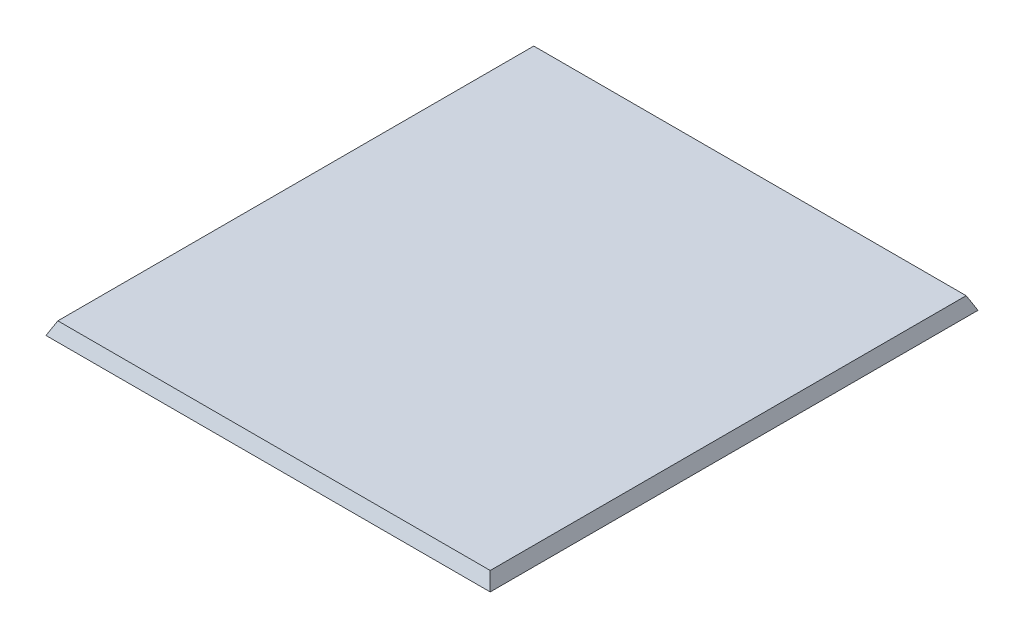
ISO-10303-21;
HEADER;
FILE_DESCRIPTION(('STEP AP214'),'2;1');
FILE_NAME('part.step','',(''),(''),'','','');
FILE_SCHEMA(('AUTOMOTIVE_DESIGN { 1 0 10303 214 1 1 1 1 }'));
ENDSEC;
DATA;
#1=APPLICATION_CONTEXT('core data for automotive mechanical design processes');
#2=APPLICATION_PROTOCOL_DEFINITION('international standard','automotive_design',2000,#1);
#3=PRODUCT_CONTEXT('',#1,'mechanical');
#4=PRODUCT('Part','Part','',(#3));
#5=PRODUCT_RELATED_PRODUCT_CATEGORY('part','',(#4));
#6=PRODUCT_DEFINITION_FORMATION('','',#4);
#7=PRODUCT_DEFINITION_CONTEXT('part definition',#1,'design');
#8=PRODUCT_DEFINITION('design','',#6,#7);
#9=PRODUCT_DEFINITION_SHAPE('','',#8);
#10=(LENGTH_UNIT() NAMED_UNIT(*) SI_UNIT(.MILLI.,.METRE.));
#11=(NAMED_UNIT(*) PLANE_ANGLE_UNIT() SI_UNIT($,.RADIAN.));
#12=(NAMED_UNIT(*) SI_UNIT($,.STERADIAN.) SOLID_ANGLE_UNIT());
#13=UNCERTAINTY_MEASURE_WITH_UNIT(LENGTH_MEASURE(1.E-05),#10,'distance_accuracy_value','');
#14=(GEOMETRIC_REPRESENTATION_CONTEXT(3) GLOBAL_UNCERTAINTY_ASSIGNED_CONTEXT((#13)) GLOBAL_UNIT_ASSIGNED_CONTEXT((#10,
#11,#12)) REPRESENTATION_CONTEXT('',''));
#15=CARTESIAN_POINT('',(0.,0.,0.));
#16=DIRECTION('',(0.,0.,1.));
#17=DIRECTION('',(1.,0.,0.));
#18=AXIS2_PLACEMENT_3D('',#15,#16,#17);
#19=CARTESIAN_POINT('',(-5.904,3.6256,0.773999999999973));
#20=DIRECTION('',(0.,0.422618261740701,-0.906307787036649));
#21=DIRECTION('',(0.,-0.906307787036649,-0.422618261740701));
#22=AXIS2_PLACEMENT_3D('',#19,#20,#21);
#23=PLANE('',#22);
#24=DIRECTION('',(-1.,0.,0.));
#25=VECTOR('',#24,1.);
#26=CARTESIAN_POINT('',(-5.904,3.5856,0.755347693673773));
#27=LINE('',#26,#25);
#28=CARTESIAN_POINT('',(-5.904,3.5856,0.755347693673773));
#29=VERTEX_POINT('',#28);
#30=CARTESIAN_POINT('',(-7.304,3.5856,0.755347693673773));
#31=VERTEX_POINT('',#30);
#32=EDGE_CURVE('E11',#29,#31,#27,.T.);
#33=ORIENTED_EDGE('',*,*,#32,.T.);
#34=DIRECTION('',(-0.389281620635026,-0.834817129478987,-0.389281620635026));
#35=VECTOR('',#34,1.);
#36=CARTESIAN_POINT('',(-7.1875182910157,3.8353958310297,0.871829402658097));
#37=LINE('',#36,#35);
#38=CARTESIAN_POINT('',(-7.2853476936738,3.6256,0.773999999999973));
#39=VERTEX_POINT('',#38);
#40=EDGE_CURVE('E24',#39,#31,#37,.T.);
#41=ORIENTED_EDGE('',*,*,#40,.F.);
#42=DIRECTION('',(-1.,0.,0.));
#43=VECTOR('',#42,1.);
#44=CARTESIAN_POINT('',(-5.904,3.6256,0.773999999999973));
#45=LINE('',#44,#43);
#46=CARTESIAN_POINT('',(-5.9226523063262,3.6256,0.773999999999973));
#47=VERTEX_POINT('',#46);
#48=EDGE_CURVE('E88',#47,#39,#45,.T.);
#49=ORIENTED_EDGE('',*,*,#48,.F.);
#50=DIRECTION('',(0.389281620635026,-0.834817129478987,-0.389281620635026));
#51=VECTOR('',#50,1.);
#52=CARTESIAN_POINT('',(-5.9198257324651,3.6195383927934,0.771173426138822));
#53=LINE('',#52,#51);
#54=EDGE_CURVE('E77',#47,#29,#53,.T.);
#55=ORIENTED_EDGE('',*,*,#54,.T.);
#56=EDGE_LOOP('',(#33,#41,#49,#55));
#57=FACE_BOUND('',#56,.T.);
#58=ADVANCED_FACE('F17',(#57),#23,.T.);
#59=CARTESIAN_POINT('',(-7.304,3.5856,1.524));
#60=DIRECTION('',(-0.90630778703665,0.4226182617407,0.));
#61=DIRECTION('',(-0.4226182617407,-0.90630778703665,0.));
#62=AXIS2_PLACEMENT_3D('',#59,#60,#61);
#63=PLANE('',#62);
#64=DIRECTION('',(0.,0.,1.));
#65=VECTOR('',#64,1.);
#66=CARTESIAN_POINT('',(-7.304,3.5856,1.524));
#67=LINE('',#66,#65);
#68=CARTESIAN_POINT('',(-7.304,3.5856,2.2926523063262));
#69=VERTEX_POINT('',#68);
#70=EDGE_CURVE('E85',#31,#69,#67,.T.);
#71=ORIENTED_EDGE('',*,*,#70,.T.);
#72=DIRECTION('',(-0.389281620635026,-0.834817129478987,0.389281620635025));
#73=VECTOR('',#72,1.);
#74=CARTESIAN_POINT('',(-7.076018015305,4.0745089439299,2.0646703216312));
#75=LINE('',#74,#73);
#76=CARTESIAN_POINT('',(-7.2853476936738,3.6256,2.274));
#77=VERTEX_POINT('',#76);
#78=EDGE_CURVE('E83',#77,#69,#75,.T.);
#79=ORIENTED_EDGE('',*,*,#78,.F.);
#80=DIRECTION('',(0.,0.,1.));
#81=VECTOR('',#80,1.);
#82=CARTESIAN_POINT('',(-7.2853476936738,3.6256,1.524));
#83=LINE('',#82,#81);
#84=EDGE_CURVE('E72',#39,#77,#83,.T.);
#85=ORIENTED_EDGE('',*,*,#84,.F.);
#86=ORIENTED_EDGE('',*,*,#40,.T.);
#87=EDGE_LOOP('',(#71,#79,#85,#86));
#88=FACE_BOUND('',#87,.T.);
#89=ADVANCED_FACE('F90',(#88),#63,.T.);
#90=CARTESIAN_POINT('',(-5.904,3.6256,2.274));
#91=DIRECTION('',(0.,0.4226182617407,0.90630778703665));
#92=DIRECTION('',(0.,0.90630778703665,-0.4226182617407));
#93=AXIS2_PLACEMENT_3D('',#90,#91,#92);
#94=PLANE('',#93);
#95=DIRECTION('',(1.,0.,0.));
#96=VECTOR('',#95,1.);
#97=CARTESIAN_POINT('',(-5.904,3.5856,2.2926523063262));
#98=LINE('',#97,#96);
#99=CARTESIAN_POINT('',(-5.904,3.5856,2.2926523063262));
#100=VERTEX_POINT('',#99);
#101=EDGE_CURVE('E60',#69,#100,#98,.T.);
#102=ORIENTED_EDGE('',*,*,#101,.T.);
#103=DIRECTION('',(0.389281620635026,-0.834817129478987,0.389281620635025));
#104=VECTOR('',#103,1.);
#105=CARTESIAN_POINT('',(-6.0204817089843,3.8353958310297,2.1761705973418));
#106=LINE('',#105,#104);
#107=CARTESIAN_POINT('',(-5.9226523063262,3.6256,2.274));
#108=VERTEX_POINT('',#107);
#109=EDGE_CURVE('E54',#108,#100,#106,.T.);
#110=ORIENTED_EDGE('',*,*,#109,.F.);
#111=DIRECTION('',(1.,0.,0.));
#112=VECTOR('',#111,1.);
#113=CARTESIAN_POINT('',(-5.904,3.6256,2.274));
#114=LINE('',#113,#112);
#115=EDGE_CURVE('E58',#77,#108,#114,.T.);
#116=ORIENTED_EDGE('',*,*,#115,.F.);
#117=ORIENTED_EDGE('',*,*,#78,.T.);
#118=EDGE_LOOP('',(#102,#110,#116,#117));
#119=FACE_BOUND('',#118,.T.);
#120=ADVANCED_FACE('F56',(#119),#94,.T.);
#121=CARTESIAN_POINT('',(-5.904,3.5856,1.524));
#122=DIRECTION('',(0.90630778703665,0.4226182617407,0.));
#123=DIRECTION('',(-0.4226182617407,0.90630778703665,0.));
#124=AXIS2_PLACEMENT_3D('',#121,#122,#123);
#125=PLANE('',#124);
#126=DIRECTION('',(0.,0.,-1.));
#127=VECTOR('',#126,1.);
#128=CARTESIAN_POINT('',(-5.904,3.5856,1.524));
#129=LINE('',#128,#127);
#130=EDGE_CURVE('E73',#100,#29,#129,.T.);
#131=ORIENTED_EDGE('',*,*,#130,.T.);
#132=ORIENTED_EDGE('',*,*,#54,.F.);
#133=DIRECTION('',(0.,0.,-1.));
#134=VECTOR('',#133,1.);
#135=CARTESIAN_POINT('',(-5.9226523063262,3.6256,1.524));
#136=LINE('',#135,#134);
#137=EDGE_CURVE('E70',#108,#47,#136,.T.);
#138=ORIENTED_EDGE('',*,*,#137,.F.);
#139=ORIENTED_EDGE('',*,*,#109,.T.);
#140=EDGE_LOOP('',(#131,#132,#138,#139));
#141=FACE_BOUND('',#140,.T.);
#142=ADVANCED_FACE('F76',(#141),#125,.T.);
#143=CARTESIAN_POINT('',(-6.604,3.6256,1.524));
#144=DIRECTION('',(0.,1.,0.));
#145=DIRECTION('',(-1.,0.,0.));
#146=AXIS2_PLACEMENT_3D('',#143,#144,#145);
#147=PLANE('',#146);
#148=ORIENTED_EDGE('',*,*,#48,.T.);
#149=ORIENTED_EDGE('',*,*,#84,.T.);
#150=ORIENTED_EDGE('',*,*,#115,.T.);
#151=ORIENTED_EDGE('',*,*,#137,.T.);
#152=EDGE_LOOP('',(#148,#149,#150,#151));
#153=FACE_BOUND('',#152,.T.);
#154=ADVANCED_FACE('F69',(#153),#147,.T.);
#155=CARTESIAN_POINT('',(-6.604,3.5856,1.524));
#156=DIRECTION('',(0.,1.,0.));
#157=DIRECTION('',(-1.,0.,0.));
#158=AXIS2_PLACEMENT_3D('',#155,#156,#157);
#159=PLANE('',#158);
#160=ORIENTED_EDGE('',*,*,#32,.F.);
#161=ORIENTED_EDGE('',*,*,#130,.F.);
#162=ORIENTED_EDGE('',*,*,#101,.F.);
#163=ORIENTED_EDGE('',*,*,#70,.F.);
#164=EDGE_LOOP('',(#160,#161,#162,#163));
#165=FACE_BOUND('',#164,.T.);
#166=ADVANCED_FACE('F91',(#165),#159,.F.);
#167=CLOSED_SHELL('',(#58,#89,#120,#142,#154,#166));
#168=MANIFOLD_SOLID_BREP('B1',#167);
#169=ADVANCED_BREP_SHAPE_REPRESENTATION('',(#18,#168),#14);
#170=SHAPE_DEFINITION_REPRESENTATION(#9,#169);
ENDSEC;
END-ISO-10303-21;
